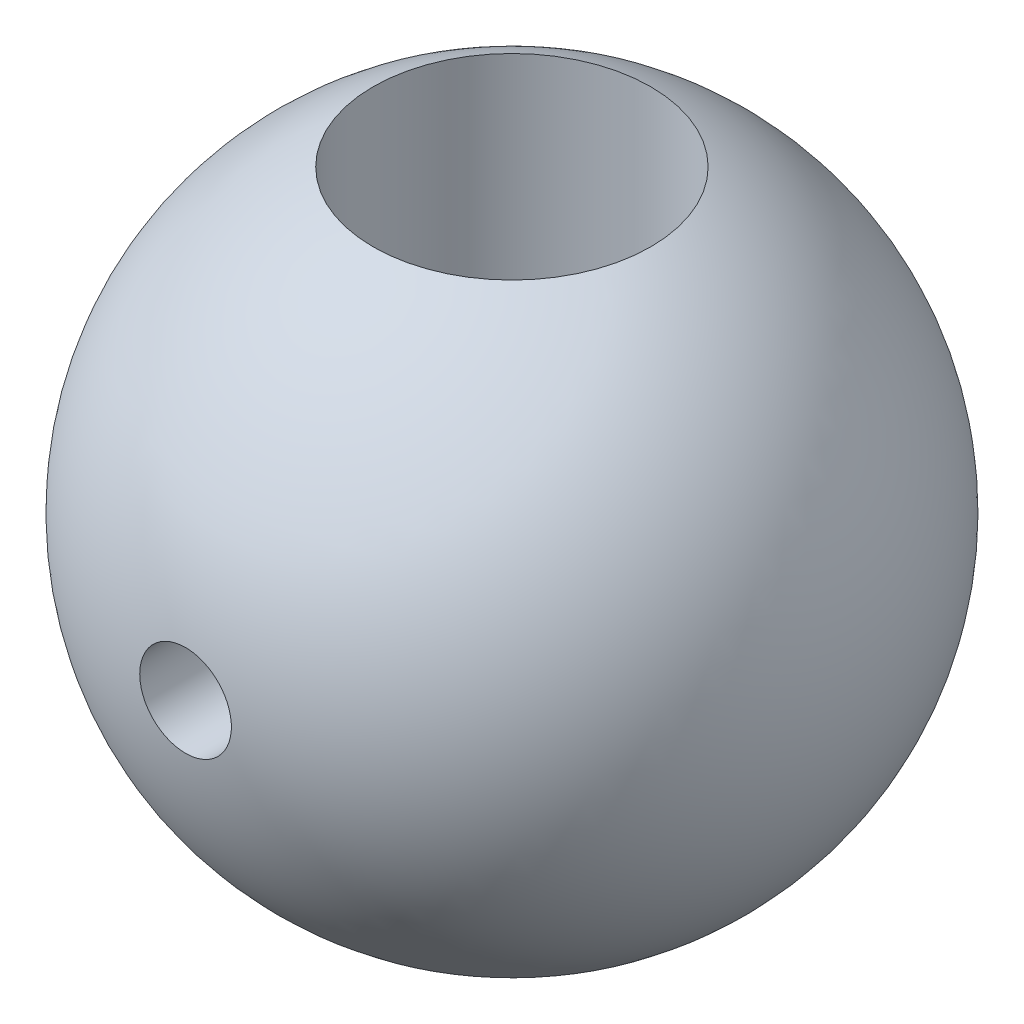
ISO-10303-21;
HEADER;
FILE_DESCRIPTION(('STEP AP214'),'2;1');
FILE_NAME('part.step','',(''),(''),'','','');
FILE_SCHEMA(('AUTOMOTIVE_DESIGN { 1 0 10303 214 1 1 1 1 }'));
ENDSEC;
DATA;
#1=APPLICATION_CONTEXT('core data for automotive mechanical design processes');
#2=APPLICATION_PROTOCOL_DEFINITION('international standard','automotive_design',2000,#1);
#3=PRODUCT_CONTEXT('',#1,'mechanical');
#4=PRODUCT('Part','Part','',(#3));
#5=PRODUCT_RELATED_PRODUCT_CATEGORY('part','',(#4));
#6=PRODUCT_DEFINITION_FORMATION('','',#4);
#7=PRODUCT_DEFINITION_CONTEXT('part definition',#1,'design');
#8=PRODUCT_DEFINITION('design','',#6,#7);
#9=PRODUCT_DEFINITION_SHAPE('','',#8);
#10=(LENGTH_UNIT() NAMED_UNIT(*) SI_UNIT(.MILLI.,.METRE.));
#11=(NAMED_UNIT(*) PLANE_ANGLE_UNIT() SI_UNIT($,.RADIAN.));
#12=(NAMED_UNIT(*) SI_UNIT($,.STERADIAN.) SOLID_ANGLE_UNIT());
#13=UNCERTAINTY_MEASURE_WITH_UNIT(LENGTH_MEASURE(1.E-05),#10,'distance_accuracy_value','');
#14=(GEOMETRIC_REPRESENTATION_CONTEXT(3) GLOBAL_UNCERTAINTY_ASSIGNED_CONTEXT((#13)) GLOBAL_UNIT_ASSIGNED_CONTEXT((#10,
#11,#12)) REPRESENTATION_CONTEXT('',''));
#15=CARTESIAN_POINT('',(0.,0.,0.));
#16=DIRECTION('',(0.,0.,1.));
#17=DIRECTION('',(1.,0.,0.));
#18=AXIS2_PLACEMENT_3D('',#15,#16,#17);
#19=CARTESIAN_POINT('',(0.,0.,0.));
#20=DIRECTION('',(0.,-1.,0.));
#21=DIRECTION('',(-1.,0.,0.));
#22=AXIS2_PLACEMENT_3D('',#19,#20,#21);
#23=SPHERICAL_SURFACE('',#22,9.5);
#24=CARTESIAN_POINT('',(0.,0.,9.40773550648614));
#25=DIRECTION('',(0.,0.,-1.));
#26=DIRECTION('',(-1.,0.,0.));
#27=AXIS2_PLACEMENT_3D('',#24,#25,#26);
#28=CIRCLE('',#27,1.3208);
#29=CARTESIAN_POINT('',(-1.3208,0.,9.40773550648614));
#30=VERTEX_POINT('',#29);
#31=EDGE_CURVE('E47',#30,#30,#28,.F.);
#32=ORIENTED_EDGE('',*,*,#31,.F.);
#33=EDGE_LOOP('',(#32));
#34=FACE_BOUND('',#33,.T.);
#35=CARTESIAN_POINT('',(0.,8.61684396980704,0.));
#36=DIRECTION('',(0.,-1.,0.));
#37=DIRECTION('',(0.,0.,-1.));
#38=AXIS2_PLACEMENT_3D('',#35,#36,#37);
#39=CIRCLE('',#38,4.);
#40=CARTESIAN_POINT('',(0.,8.61684396980704,-4.));
#41=VERTEX_POINT('',#40);
#42=EDGE_CURVE('E39',#41,#41,#39,.T.);
#43=ORIENTED_EDGE('',*,*,#42,.T.);
#44=EDGE_LOOP('',(#43));
#45=FACE_BOUND('',#44,.T.);
#46=CARTESIAN_POINT('',(0.,-8.61684396980704,0.));
#47=DIRECTION('',(0.,1.,0.));
#48=DIRECTION('',(0.,0.,1.));
#49=AXIS2_PLACEMENT_3D('',#46,#47,#48);
#50=CIRCLE('',#49,4.);
#51=CARTESIAN_POINT('',(0.,-8.61684396980704,4.));
#52=VERTEX_POINT('',#51);
#53=EDGE_CURVE('E10',#52,#52,#50,.T.);
#54=ORIENTED_EDGE('',*,*,#53,.T.);
#55=EDGE_LOOP('',(#54));
#56=FACE_BOUND('',#55,.T.);
#57=ADVANCED_FACE('F33',(#34,#45,#56),#23,.T.);
#58=CARTESIAN_POINT('',(0.,9.5,0.));
#59=DIRECTION('',(0.,-1.,0.));
#60=DIRECTION('',(0.,0.,-1.));
#61=AXIS2_PLACEMENT_3D('',#58,#59,#60);
#62=CYLINDRICAL_SURFACE('',#61,4.);
#63=CARTESIAN_POINT('',(-1.3208,0.,3.77564396626589));
#64=CARTESIAN_POINT('',(-1.32080020359189,0.0719844021371245,3.7756438474824));
#65=CARTESIAN_POINT('',(-1.31489530095733,0.143967845056705,3.77772509320265));
#66=CARTESIAN_POINT('',(-1.29150949603221,0.285804879683225,3.78578295749277));
#67=CARTESIAN_POINT('',(-1.27402650520045,0.355658084743573,3.7917602788625));
#68=CARTESIAN_POINT('',(-1.22816335160803,0.491157415313953,3.80686103977436));
#69=CARTESIAN_POINT('',(-1.19980422159064,0.556811377334499,3.81597840351895));
#70=CARTESIAN_POINT('',(-1.13306537607265,0.682450500367911,3.8363231744045));
#71=CARTESIAN_POINT('',(-1.09468351480126,0.742434443734163,3.84755103323786));
#72=CARTESIAN_POINT('',(-1.00741054470108,0.857333415070259,3.87133506688686));
#73=CARTESIAN_POINT('',(-0.958199864311839,0.911999010424466,3.88392389284132));
#74=CARTESIAN_POINT('',(-0.851348458438005,1.01247115768786,3.90873514412864));
#75=CARTESIAN_POINT('',(-0.793706410032205,1.0582763167288,3.92095751159914));
#76=CARTESIAN_POINT('',(-0.669809340806889,1.14085433091633,3.94403605770373));
#77=CARTESIAN_POINT('',(-0.603371895676157,1.17736652555245,3.95484935432257));
#78=CARTESIAN_POINT('',(-0.464880092006891,1.23859875833685,3.97350720279669));
#79=CARTESIAN_POINT('',(-0.39282722301917,1.26332191135067,3.98135253872439));
#80=CARTESIAN_POINT('',(-0.247764584442868,1.29943041001096,3.99295925681704));
#81=CARTESIAN_POINT('',(-0.174871772080183,1.31124290302719,3.99685110704101));
#82=CARTESIAN_POINT('',(-0.0280417518475491,1.32255220353489,4.0005751104679));
#83=CARTESIAN_POINT('',(0.0458951870168871,1.32205212736423,4.00040829092905));
#84=CARTESIAN_POINT('',(0.189693880890902,1.30902296681977,3.99612253658346));
#85=CARTESIAN_POINT('',(0.259602943465333,1.29695769563627,3.99215599074227));
#86=CARTESIAN_POINT('',(0.396341760786916,1.26190672147334,3.98090719387328));
#87=CARTESIAN_POINT('',(0.463171307543191,1.23892028205931,3.97362471924765));
#88=CARTESIAN_POINT('',(0.592876791250134,1.18240453014698,3.9563666575095));
#89=CARTESIAN_POINT('',(0.655689950337244,1.14874189345811,3.94635725251994));
#90=CARTESIAN_POINT('',(0.77491416764862,1.07193872726895,3.92468917480151));
#91=CARTESIAN_POINT('',(0.831323462882503,1.02879559732927,3.91303004987795));
#92=CARTESIAN_POINT('',(0.93889876773854,0.931912039603723,3.88865692985178));
#93=CARTESIAN_POINT('',(0.989701574299565,0.87777374858761,3.87591908668639));
#94=CARTESIAN_POINT('',(1.08162328561956,0.761635866147427,3.8512804918467));
#95=CARTESIAN_POINT('',(1.12274075551139,0.699635112002469,3.8393798643875));
#96=CARTESIAN_POINT('',(1.19461481248019,0.568400654642189,3.81763414880982));
#97=CARTESIAN_POINT('',(1.22522106813447,0.499079174455108,3.80781959412454));
#98=CARTESIAN_POINT('',(1.27420433565262,0.35586130026927,3.79171148785435));
#99=CARTESIAN_POINT('',(1.29258635814949,0.281966794316692,3.78541649379333));
#100=CARTESIAN_POINT('',(1.31586587699225,0.135212767575113,3.77738570888663));
#101=CARTESIAN_POINT('',(1.32132544047056,0.0624527758456945,3.7754600369035));
#102=CARTESIAN_POINT('',(1.32019500348854,-0.0829541141685456,3.77585572551894));
#103=CARTESIAN_POINT('',(1.31360713938809,-0.155601030218646,3.77817633312848));
#104=CARTESIAN_POINT('',(1.28907349168149,-0.29618405633807,3.78661408922957));
#105=CARTESIAN_POINT('',(1.27151545617815,-0.364196452193372,3.79260149466053));
#106=CARTESIAN_POINT('',(1.22600360914375,-0.496297056864192,3.80755630127551));
#107=CARTESIAN_POINT('',(1.19804797659039,-0.560384575990415,3.81652422443442));
#108=CARTESIAN_POINT('',(1.13154046136129,-0.685036253430322,3.83677693017149));
#109=CARTESIAN_POINT('',(1.09268461917607,-0.745427613081465,3.84812538209838));
#110=CARTESIAN_POINT('',(1.00582571446972,-0.859036453571396,3.87173565148099));
#111=CARTESIAN_POINT('',(0.957820004185183,-0.912251850220015,3.88399773269308));
#112=CARTESIAN_POINT('',(0.851340054235707,-1.01258621409556,3.90875182487517));
#113=CARTESIAN_POINT('',(0.792479431424463,-1.05930033746362,3.92122749248037));
#114=CARTESIAN_POINT('',(0.667448625035769,-1.14221292166004,3.94443268774615));
#115=CARTESIAN_POINT('',(0.601278714999488,-1.17841177582564,3.95516228071431));
#116=CARTESIAN_POINT('',(0.463850866952603,-1.23893177087868,3.97361437573251));
#117=CARTESIAN_POINT('',(0.392630523481835,-1.26333188515504,3.98135679939988));
#118=CARTESIAN_POINT('',(0.246792086579059,-1.29971108932066,3.99304842814267));
#119=CARTESIAN_POINT('',(0.172175203894282,-1.31169456966486,3.99699897396928));
#120=CARTESIAN_POINT('',(0.0253683251228354,-1.32251100771001,4.00056241882666));
#121=CARTESIAN_POINT('',(-0.0467746260038123,-1.3219256768912,4.00036719763956));
#122=CARTESIAN_POINT('',(-0.18988658856824,-1.30905171367289,3.99613150302709));
#123=CARTESIAN_POINT('',(-0.260855691810051,-1.29676400093572,3.99209133176721));
#124=CARTESIAN_POINT('',(-0.398523591848519,-1.26121775258016,3.98068860522317));
#125=CARTESIAN_POINT('',(-0.465271195343734,-1.23813040269049,3.97337796657655));
#126=CARTESIAN_POINT('',(-0.593972249136161,-1.18179808514008,3.95618717456934));
#127=CARTESIAN_POINT('',(-0.65592483541947,-1.14855129216547,3.94630655951701));
#128=CARTESIAN_POINT('',(-0.77574253758882,-1.07144547239734,3.92454685720287));
#129=CARTESIAN_POINT('',(-0.833375838887687,-1.02724331075635,3.91260797646128));
#130=CARTESIAN_POINT('',(-0.940597450599504,-0.930068450264218,3.88822651555641));
#131=CARTESIAN_POINT('',(-0.990183208855611,-0.877092979810138,3.87578377715937));
#132=CARTESIAN_POINT('',(-1.08182563617772,-0.761454372074726,3.85123264682559));
#133=CARTESIAN_POINT('',(-1.12352229130517,-0.698498447315956,3.83915518899839));
#134=CARTESIAN_POINT('',(-1.19571140763928,-0.566098568275823,3.81729013833719));
#135=CARTESIAN_POINT('',(-1.22620705378381,-0.496656465354439,3.8075018948672));
#136=CARTESIAN_POINT('',(-1.2736961777243,-0.356894704176425,3.79187210405362));
#137=CARTESIAN_POINT('',(-1.29130313314265,-0.286803642158266,3.78585354690674));
#138=CARTESIAN_POINT('',(-1.31485302807541,-0.144474256353857,3.77774018149055));
#139=CARTESIAN_POINT('',(-1.3207997956947,-0.0722366452010396,3.77564408546561));
#140=CARTESIAN_POINT('',(-1.3208,0.,3.77564396626589));
#141=B_SPLINE_CURVE_WITH_KNOTS('',3,(#63,#64,#65,#66,#67,#68,#69,#70,#71,#72,#73,#74,#75,#76,
#77,#78,#79,#80,#81,#82,#83,#84,#85,#86,#87,#88,#89,#90,#91,#92,#93,#94,#95,#96,#97,#98,#99,
#100,#101,#102,#103,#104,#105,#106,#107,#108,#109,#110,#111,#112,#113,#114,#115,#116,#117,#118,
#119,#120,#121,#122,#123,#124,#125,#126,#127,#128,#129,#130,#131,#132,#133,#134,#135,#136,#137,
#138,#139,#140),.UNSPECIFIED.,.T.,.F.,(4,2,2,2,2,2,2,2,2,2,2,2,2,2,2,2,2,2,2,2,2,2,2,2,2,2,2,2,
2,2,2,2,2,2,2,2,2,2,4),(0.,0.215685804143048,0.431410525888347,0.646720156548107,
0.862075920783854,1.084935181802,1.30782944806845,1.5364183379618,1.76494679726622,
1.98566131883941,2.2063199776643,2.41848409846757,2.6306625279214,2.84560251031924,
3.06060152315218,3.28554502321652,3.51052182737056,3.73859393241658,3.96657249448594,
4.18443666061887,4.40226219683444,4.61279307777959,4.8233608482188,5.04051188641255,
5.25772585883824,5.4851637349673,5.71259310239274,5.93847837159605,6.16428374169824,
6.37966186558525,6.59502306481489,6.80708058879831,7.01917623488583,7.23901548016273,
7.45892430847715,7.68723453248417,7.91547978753708,8.13199247809546,8.3484340744166),.UNSPECIFIED.);
#142=CARTESIAN_POINT('',(-1.3208,0.,3.77564396626589));
#143=VERTEX_POINT('',#142);
#144=EDGE_CURVE('E43',#143,#143,#141,.T.);
#145=ORIENTED_EDGE('',*,*,#144,.F.);
#146=EDGE_LOOP('',(#145));
#147=FACE_BOUND('',#146,.T.);
#148=ORIENTED_EDGE('',*,*,#53,.F.);
#149=EDGE_LOOP('',(#148));
#150=FACE_BOUND('',#149,.T.);
#151=ORIENTED_EDGE('',*,*,#42,.F.);
#152=EDGE_LOOP('',(#151));
#153=FACE_BOUND('',#152,.T.);
#154=ADVANCED_FACE('F53',(#147,#150,#153),#62,.F.);
#155=CARTESIAN_POINT('',(0.,0.,0.));
#156=DIRECTION('',(0.,0.,-1.));
#157=DIRECTION('',(-1.,0.,0.));
#158=AXIS2_PLACEMENT_3D('',#155,#156,#157);
#159=CYLINDRICAL_SURFACE('',#158,1.3208);
#160=ORIENTED_EDGE('',*,*,#144,.T.);
#161=EDGE_LOOP('',(#160));
#162=FACE_BOUND('',#161,.T.);
#163=ORIENTED_EDGE('',*,*,#31,.T.);
#164=EDGE_LOOP('',(#163));
#165=FACE_BOUND('',#164,.T.);
#166=ADVANCED_FACE('F55',(#162,#165),#159,.F.);
#167=CLOSED_SHELL('',(#57,#154,#166));
#168=MANIFOLD_SOLID_BREP('B2',#167);
#169=ADVANCED_BREP_SHAPE_REPRESENTATION('',(#18,#168),#14);
#170=SHAPE_DEFINITION_REPRESENTATION(#9,#169);
ENDSEC;
END-ISO-10303-21;
